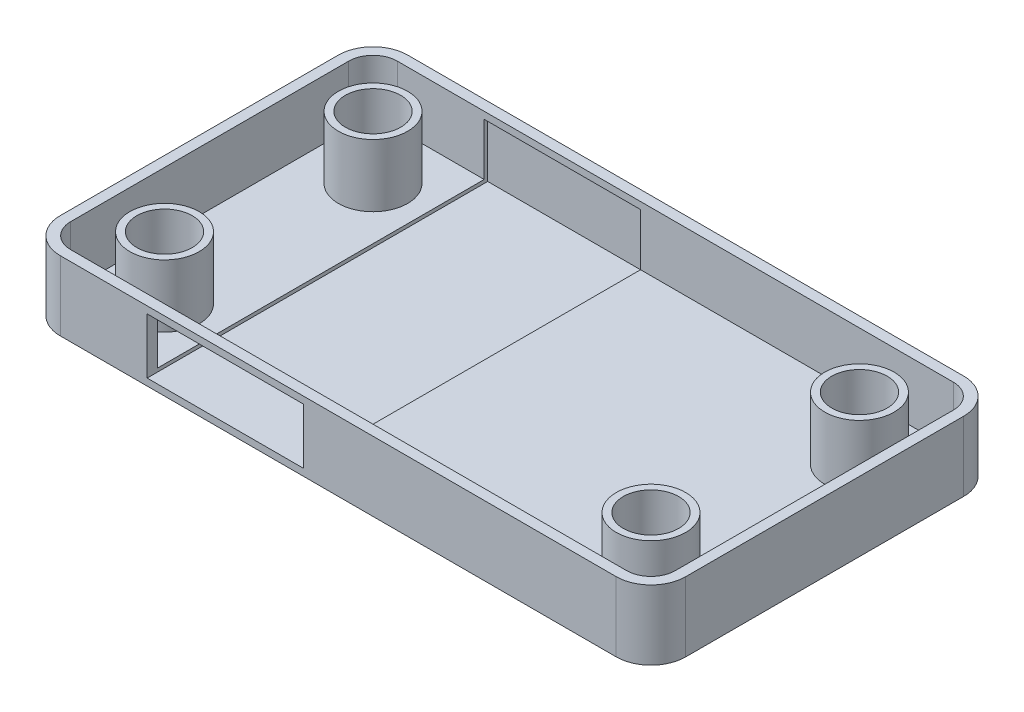
ISO-10303-21;
HEADER;
FILE_DESCRIPTION(('STEP AP214'),'2;1');
FILE_NAME('part.step','',(''),(''),'','','');
FILE_SCHEMA(('AUTOMOTIVE_DESIGN { 1 0 10303 214 1 1 1 1 }'));
ENDSEC;
DATA;
#1=APPLICATION_CONTEXT('core data for automotive mechanical design processes');
#2=APPLICATION_PROTOCOL_DEFINITION('international standard','automotive_design',2000,#1);
#3=PRODUCT_CONTEXT('',#1,'mechanical');
#4=PRODUCT('Part','Part','',(#3));
#5=PRODUCT_RELATED_PRODUCT_CATEGORY('part','',(#4));
#6=PRODUCT_DEFINITION_FORMATION('','',#4);
#7=PRODUCT_DEFINITION_CONTEXT('part definition',#1,'design');
#8=PRODUCT_DEFINITION('design','',#6,#7);
#9=PRODUCT_DEFINITION_SHAPE('','',#8);
#10=(LENGTH_UNIT() NAMED_UNIT(*) SI_UNIT(.MILLI.,.METRE.));
#11=(NAMED_UNIT(*) PLANE_ANGLE_UNIT() SI_UNIT($,.RADIAN.));
#12=(NAMED_UNIT(*) SI_UNIT($,.STERADIAN.) SOLID_ANGLE_UNIT());
#13=UNCERTAINTY_MEASURE_WITH_UNIT(LENGTH_MEASURE(1.E-05),#10,'distance_accuracy_value','');
#14=(GEOMETRIC_REPRESENTATION_CONTEXT(3) GLOBAL_UNCERTAINTY_ASSIGNED_CONTEXT((#13)) GLOBAL_UNIT_ASSIGNED_CONTEXT((#10,
#11,#12)) REPRESENTATION_CONTEXT('',''));
#15=CARTESIAN_POINT('',(0.,0.,0.));
#16=DIRECTION('',(0.,0.,1.));
#17=DIRECTION('',(1.,0.,0.));
#18=AXIS2_PLACEMENT_3D('',#15,#16,#17);
#19=CARTESIAN_POINT('',(-80.,3.,-40.));
#20=DIRECTION('',(0.,-1.,0.));
#21=DIRECTION('',(0.,0.,-1.));
#22=AXIS2_PLACEMENT_3D('',#19,#20,#21);
#23=PLANE('',#22);
#24=CARTESIAN_POINT('',(-70.,3.,30.));
#25=DIRECTION('',(0.,-1.,0.));
#26=DIRECTION('',(0.,0.,-1.));
#27=AXIS2_PLACEMENT_3D('',#24,#25,#26);
#28=CIRCLE('',#27,9.97285125692813);
#29=CARTESIAN_POINT('',(-70.,3.,20.0271487430719));
#30=VERTEX_POINT('',#29);
#31=EDGE_CURVE('E419',#30,#30,#28,.F.);
#32=ORIENTED_EDGE('',*,*,#31,.F.);
#33=EDGE_LOOP('',(#32));
#34=FACE_BOUND('',#33,.T.);
#35=CARTESIAN_POINT('',(-70.,3.,-30.));
#36=DIRECTION('',(0.,-1.,0.));
#37=DIRECTION('',(0.,0.,-1.));
#38=AXIS2_PLACEMENT_3D('',#35,#36,#37);
#39=CIRCLE('',#38,9.97285125692813);
#40=CARTESIAN_POINT('',(-70.,3.,-39.9728512569281));
#41=VERTEX_POINT('',#40);
#42=EDGE_CURVE('E395',#41,#41,#39,.F.);
#43=ORIENTED_EDGE('',*,*,#42,.F.);
#44=EDGE_LOOP('',(#43));
#45=FACE_BOUND('',#44,.T.);
#46=DIRECTION('',(1.,0.,0.));
#47=VECTOR('',#46,1.);
#48=CARTESIAN_POINT('',(-80.,3.,47.));
#49=LINE('',#48,#47);
#50=CARTESIAN_POINT('',(-79.9999999999999,3.,47.));
#51=VERTEX_POINT('',#50);
#52=CARTESIAN_POINT('',(-55.,3.,47.));
#53=VERTEX_POINT('',#52);
#54=EDGE_CURVE('E305',#51,#53,#49,.T.);
#55=ORIENTED_EDGE('',*,*,#54,.T.);
#56=DIRECTION('',(0.,0.,-1.));
#57=VECTOR('',#56,1.);
#58=CARTESIAN_POINT('',(-55.,3.,-40.));
#59=LINE('',#58,#57);
#60=CARTESIAN_POINT('',(-55.,3.,-47.));
#61=VERTEX_POINT('',#60);
#62=EDGE_CURVE('E243',#53,#61,#59,.T.);
#63=ORIENTED_EDGE('',*,*,#62,.T.);
#64=DIRECTION('',(1.,0.,0.));
#65=VECTOR('',#64,1.);
#66=CARTESIAN_POINT('',(-80.,3.,-47.));
#67=LINE('',#66,#65);
#68=CARTESIAN_POINT('',(-80.,3.,-47.));
#69=VERTEX_POINT('',#68);
#70=EDGE_CURVE('E326',#69,#61,#67,.T.);
#71=ORIENTED_EDGE('',*,*,#70,.F.);
#72=CARTESIAN_POINT('',(-80.,3.,-40.));
#73=DIRECTION('',(0.,-1.,0.));
#74=DIRECTION('',(0.,0.,-1.));
#75=AXIS2_PLACEMENT_3D('',#72,#73,#74);
#76=CIRCLE('',#75,7.);
#77=CARTESIAN_POINT('',(-87.,3.,-39.9999999999999));
#78=VERTEX_POINT('',#77);
#79=EDGE_CURVE('E284',#78,#69,#76,.T.);
#80=ORIENTED_EDGE('',*,*,#79,.F.);
#81=DIRECTION('',(0.,0.,-1.));
#82=VECTOR('',#81,1.);
#83=CARTESIAN_POINT('',(-87.,3.,-40.));
#84=LINE('',#83,#82);
#85=CARTESIAN_POINT('',(-87.,3.,40.));
#86=VERTEX_POINT('',#85);
#87=EDGE_CURVE('E296',#86,#78,#84,.T.);
#88=ORIENTED_EDGE('',*,*,#87,.F.);
#89=CARTESIAN_POINT('',(-80.,3.,40.));
#90=DIRECTION('',(0.,-1.,0.));
#91=DIRECTION('',(0.,0.,-1.));
#92=AXIS2_PLACEMENT_3D('',#89,#90,#91);
#93=CIRCLE('',#92,7.);
#94=EDGE_CURVE('E300',#51,#86,#93,.T.);
#95=ORIENTED_EDGE('',*,*,#94,.F.);
#96=EDGE_LOOP('',(#55,#63,#71,#80,#88,#95));
#97=FACE_BOUND('',#96,.T.);
#98=ADVANCED_FACE('F35',(#34,#45,#97),#23,.F.);
#99=CARTESIAN_POINT('',(-10.,3.,-47.));
#100=VERTEX_POINT('',#99);
#101=CARTESIAN_POINT('',(79.9999999999999,3.,-47.));
#102=VERTEX_POINT('',#101);
#103=EDGE_CURVE('E287',#100,#102,#67,.T.);
#104=ORIENTED_EDGE('',*,*,#103,.F.);
#105=DIRECTION('',(0.,0.,1.));
#106=VECTOR('',#105,1.);
#107=CARTESIAN_POINT('',(-10.,3.,-40.));
#108=LINE('',#107,#106);
#109=CARTESIAN_POINT('',(-10.,3.,47.));
#110=VERTEX_POINT('',#109);
#111=EDGE_CURVE('E58',#100,#110,#108,.T.);
#112=ORIENTED_EDGE('',*,*,#111,.T.);
#113=CARTESIAN_POINT('',(80.,3.,47.));
#114=VERTEX_POINT('',#113);
#115=EDGE_CURVE('E310',#110,#114,#49,.T.);
#116=ORIENTED_EDGE('',*,*,#115,.T.);
#117=CARTESIAN_POINT('',(80.,3.,40.));
#118=DIRECTION('',(0.,-1.,0.));
#119=DIRECTION('',(0.,0.,-1.));
#120=AXIS2_PLACEMENT_3D('',#117,#118,#119);
#121=CIRCLE('',#120,7.);
#122=CARTESIAN_POINT('',(87.,3.,39.9999999999999));
#123=VERTEX_POINT('',#122);
#124=EDGE_CURVE('E314',#114,#123,#121,.F.);
#125=ORIENTED_EDGE('',*,*,#124,.T.);
#126=DIRECTION('',(0.,0.,-1.));
#127=VECTOR('',#126,1.);
#128=CARTESIAN_POINT('',(87.,3.,-40.));
#129=LINE('',#128,#127);
#130=CARTESIAN_POINT('',(87.,3.,-40.));
#131=VERTEX_POINT('',#130);
#132=EDGE_CURVE('E316',#123,#131,#129,.T.);
#133=ORIENTED_EDGE('',*,*,#132,.T.);
#134=CARTESIAN_POINT('',(80.,3.,-40.));
#135=DIRECTION('',(0.,-1.,0.));
#136=DIRECTION('',(0.,0.,-1.));
#137=AXIS2_PLACEMENT_3D('',#134,#135,#136);
#138=CIRCLE('',#137,7.);
#139=EDGE_CURVE('E322',#102,#131,#138,.T.);
#140=ORIENTED_EDGE('',*,*,#139,.F.);
#141=EDGE_LOOP('',(#104,#112,#116,#125,#133,#140));
#142=FACE_BOUND('',#141,.T.);
#143=CARTESIAN_POINT('',(70.,3.,-30.));
#144=DIRECTION('',(0.,-1.,0.));
#145=DIRECTION('',(0.,0.,-1.));
#146=AXIS2_PLACEMENT_3D('',#143,#144,#145);
#147=CIRCLE('',#146,9.97285125692813);
#148=CARTESIAN_POINT('',(70.,3.,-39.9728512569282));
#149=VERTEX_POINT('',#148);
#150=EDGE_CURVE('E413',#149,#149,#147,.F.);
#151=ORIENTED_EDGE('',*,*,#150,.F.);
#152=EDGE_LOOP('',(#151));
#153=FACE_BOUND('',#152,.T.);
#154=CARTESIAN_POINT('',(69.9999999999999,3.,30.));
#155=DIRECTION('',(0.,-1.,0.));
#156=DIRECTION('',(0.,0.,-1.));
#157=AXIS2_PLACEMENT_3D('',#154,#155,#156);
#158=CIRCLE('',#157,9.97285125692813);
#159=CARTESIAN_POINT('',(69.9999999999999,3.,20.0271487430719));
#160=VERTEX_POINT('',#159);
#161=EDGE_CURVE('E416',#160,#160,#158,.F.);
#162=ORIENTED_EDGE('',*,*,#161,.F.);
#163=EDGE_LOOP('',(#162));
#164=FACE_BOUND('',#163,.T.);
#165=ADVANCED_FACE('F466',(#142,#153,#164),#23,.F.);
#166=CARTESIAN_POINT('',(-80.,20.,-40.));
#167=DIRECTION('',(0.,-1.,0.));
#168=DIRECTION('',(0.,0.,-1.));
#169=AXIS2_PLACEMENT_3D('',#166,#167,#168);
#170=CYLINDRICAL_SURFACE('',#169,10.);
#171=CARTESIAN_POINT('',(-80.,0.,-40.));
#172=DIRECTION('',(0.,-1.,0.));
#173=DIRECTION('',(0.,0.,-1.));
#174=AXIS2_PLACEMENT_3D('',#171,#172,#173);
#175=CIRCLE('',#174,10.);
#176=CARTESIAN_POINT('',(-90.,0.,-39.9999999999999));
#177=VERTEX_POINT('',#176);
#178=CARTESIAN_POINT('',(-79.9999999999999,0.,-50.));
#179=VERTEX_POINT('',#178);
#180=EDGE_CURVE('E290',#177,#179,#175,.T.);
#181=ORIENTED_EDGE('',*,*,#180,.F.);
#182=DIRECTION('',(0.,-1.,0.));
#183=VECTOR('',#182,1.);
#184=CARTESIAN_POINT('',(-90.,20.,-39.9999999999999));
#185=LINE('',#184,#183);
#186=CARTESIAN_POINT('',(-90.,20.,-39.9999999999999));
#187=VERTEX_POINT('',#186);
#188=EDGE_CURVE('E393',#187,#177,#185,.T.);
#189=ORIENTED_EDGE('',*,*,#188,.F.);
#190=CARTESIAN_POINT('',(-80.,20.,-40.));
#191=DIRECTION('',(0.,-1.,0.));
#192=DIRECTION('',(0.,0.,-1.));
#193=AXIS2_PLACEMENT_3D('',#190,#191,#192);
#194=CIRCLE('',#193,10.);
#195=CARTESIAN_POINT('',(-79.9999999999999,20.,-50.));
#196=VERTEX_POINT('',#195);
#197=EDGE_CURVE('E350',#187,#196,#194,.T.);
#198=ORIENTED_EDGE('',*,*,#197,.T.);
#199=DIRECTION('',(0.,-1.,0.));
#200=VECTOR('',#199,1.);
#201=CARTESIAN_POINT('',(-79.9999999999999,20.,-50.));
#202=LINE('',#201,#200);
#203=EDGE_CURVE('E372',#196,#179,#202,.T.);
#204=ORIENTED_EDGE('',*,*,#203,.T.);
#205=EDGE_LOOP('',(#181,#189,#198,#204));
#206=FACE_BOUND('',#205,.T.);
#207=ADVANCED_FACE('F37',(#206),#170,.T.);
#208=CARTESIAN_POINT('',(-90.,20.,39.9999999999999));
#209=DIRECTION('',(-1.,0.,0.));
#210=DIRECTION('',(0.,0.,1.));
#211=AXIS2_PLACEMENT_3D('',#208,#209,#210);
#212=PLANE('',#211);
#213=DIRECTION('',(0.,0.,-1.));
#214=VECTOR('',#213,1.);
#215=CARTESIAN_POINT('',(-90.,0.,39.9999999999999));
#216=LINE('',#215,#214);
#217=CARTESIAN_POINT('',(-90.,0.,39.9999999999999));
#218=VERTEX_POINT('',#217);
#219=EDGE_CURVE('E354',#218,#177,#216,.T.);
#220=ORIENTED_EDGE('',*,*,#219,.F.);
#221=DIRECTION('',(0.,-1.,0.));
#222=VECTOR('',#221,1.);
#223=CARTESIAN_POINT('',(-90.,20.,39.9999999999999));
#224=LINE('',#223,#222);
#225=CARTESIAN_POINT('',(-90.,20.,39.9999999999999));
#226=VERTEX_POINT('',#225);
#227=EDGE_CURVE('E396',#226,#218,#224,.T.);
#228=ORIENTED_EDGE('',*,*,#227,.F.);
#229=DIRECTION('',(0.,0.,-1.));
#230=VECTOR('',#229,1.);
#231=CARTESIAN_POINT('',(-90.,20.,39.9999999999999));
#232=LINE('',#231,#230);
#233=EDGE_CURVE('E369',#226,#187,#232,.T.);
#234=ORIENTED_EDGE('',*,*,#233,.T.);
#235=ORIENTED_EDGE('',*,*,#188,.T.);
#236=EDGE_LOOP('',(#220,#228,#234,#235));
#237=FACE_BOUND('',#236,.T.);
#238=ADVANCED_FACE('F797',(#237),#212,.T.);
#239=CARTESIAN_POINT('',(-80.,20.,40.));
#240=DIRECTION('',(0.,-1.,0.));
#241=DIRECTION('',(0.,0.,-1.));
#242=AXIS2_PLACEMENT_3D('',#239,#240,#241);
#243=CYLINDRICAL_SURFACE('',#242,10.);
#244=CARTESIAN_POINT('',(-80.,0.,40.));
#245=DIRECTION('',(0.,-1.,0.));
#246=DIRECTION('',(0.,0.,-1.));
#247=AXIS2_PLACEMENT_3D('',#244,#245,#246);
#248=CIRCLE('',#247,10.);
#249=CARTESIAN_POINT('',(-79.9999999999999,0.,50.));
#250=VERTEX_POINT('',#249);
#251=EDGE_CURVE('E388',#250,#218,#248,.T.);
#252=ORIENTED_EDGE('',*,*,#251,.F.);
#253=DIRECTION('',(0.,-1.,0.));
#254=VECTOR('',#253,1.);
#255=CARTESIAN_POINT('',(-79.9999999999999,20.,50.));
#256=LINE('',#255,#254);
#257=CARTESIAN_POINT('',(-79.9999999999999,20.,50.));
#258=VERTEX_POINT('',#257);
#259=EDGE_CURVE('E398',#258,#250,#256,.T.);
#260=ORIENTED_EDGE('',*,*,#259,.F.);
#261=CARTESIAN_POINT('',(-80.,20.,40.));
#262=DIRECTION('',(0.,-1.,0.));
#263=DIRECTION('',(0.,0.,-1.));
#264=AXIS2_PLACEMENT_3D('',#261,#262,#263);
#265=CIRCLE('',#264,10.);
#266=EDGE_CURVE('E366',#258,#226,#265,.T.);
#267=ORIENTED_EDGE('',*,*,#266,.T.);
#268=ORIENTED_EDGE('',*,*,#227,.T.);
#269=EDGE_LOOP('',(#252,#260,#267,#268));
#270=FACE_BOUND('',#269,.T.);
#271=ADVANCED_FACE('F717',(#270),#243,.T.);
#272=CARTESIAN_POINT('',(-79.9999999999999,20.,50.));
#273=DIRECTION('',(0.,0.,-1.));
#274=DIRECTION('',(-1.,0.,0.));
#275=AXIS2_PLACEMENT_3D('',#272,#273,#274);
#276=PLANE('',#275);
#277=DIRECTION('',(1.,0.,0.));
#278=VECTOR('',#277,1.);
#279=CARTESIAN_POINT('',(-55.,2.,50.));
#280=LINE('',#279,#278);
#281=CARTESIAN_POINT('',(-55.,2.,50.));
#282=VERTEX_POINT('',#281);
#283=CARTESIAN_POINT('',(-10.,2.,50.));
#284=VERTEX_POINT('',#283);
#285=EDGE_CURVE('E226',#282,#284,#280,.T.);
#286=ORIENTED_EDGE('',*,*,#285,.F.);
#287=DIRECTION('',(0.,-1.,0.));
#288=VECTOR('',#287,1.);
#289=CARTESIAN_POINT('',(-55.,18.,50.));
#290=LINE('',#289,#288);
#291=CARTESIAN_POINT('',(-55.,18.,50.));
#292=VERTEX_POINT('',#291);
#293=EDGE_CURVE('E50',#292,#282,#290,.T.);
#294=ORIENTED_EDGE('',*,*,#293,.F.);
#295=DIRECTION('',(-1.,0.,0.));
#296=VECTOR('',#295,1.);
#297=CARTESIAN_POINT('',(-55.,18.,50.));
#298=LINE('',#297,#296);
#299=CARTESIAN_POINT('',(-10.,18.,50.));
#300=VERTEX_POINT('',#299);
#301=EDGE_CURVE('E217',#300,#292,#298,.T.);
#302=ORIENTED_EDGE('',*,*,#301,.F.);
#303=DIRECTION('',(0.,1.,0.));
#304=VECTOR('',#303,1.);
#305=CARTESIAN_POINT('',(-10.,18.,50.));
#306=LINE('',#305,#304);
#307=EDGE_CURVE('E220',#284,#300,#306,.T.);
#308=ORIENTED_EDGE('',*,*,#307,.F.);
#309=EDGE_LOOP('',(#286,#294,#302,#308));
#310=FACE_BOUND('',#309,.T.);
#311=DIRECTION('',(1.,0.,0.));
#312=VECTOR('',#311,1.);
#313=CARTESIAN_POINT('',(-79.9999999999999,0.,50.));
#314=LINE('',#313,#312);
#315=CARTESIAN_POINT('',(79.9999999999999,0.,50.));
#316=VERTEX_POINT('',#315);
#317=EDGE_CURVE('E386',#250,#316,#314,.T.);
#318=ORIENTED_EDGE('',*,*,#317,.T.);
#319=DIRECTION('',(0.,-1.,0.));
#320=VECTOR('',#319,1.);
#321=CARTESIAN_POINT('',(79.9999999999999,20.,50.));
#322=LINE('',#321,#320);
#323=CARTESIAN_POINT('',(79.9999999999999,20.,50.));
#324=VERTEX_POINT('',#323);
#325=EDGE_CURVE('E400',#324,#316,#322,.T.);
#326=ORIENTED_EDGE('',*,*,#325,.F.);
#327=DIRECTION('',(1.,0.,0.));
#328=VECTOR('',#327,1.);
#329=CARTESIAN_POINT('',(-79.9999999999999,20.,50.));
#330=LINE('',#329,#328);
#331=EDGE_CURVE('E364',#258,#324,#330,.T.);
#332=ORIENTED_EDGE('',*,*,#331,.F.);
#333=ORIENTED_EDGE('',*,*,#259,.T.);
#334=EDGE_LOOP('',(#318,#326,#332,#333));
#335=FACE_BOUND('',#334,.T.);
#336=ADVANCED_FACE('F459',(#310,#335),#276,.F.);
#337=CARTESIAN_POINT('',(80.,20.,40.));
#338=DIRECTION('',(0.,-1.,0.));
#339=DIRECTION('',(0.,0.,-1.));
#340=AXIS2_PLACEMENT_3D('',#337,#338,#339);
#341=CYLINDRICAL_SURFACE('',#340,10.);
#342=CARTESIAN_POINT('',(80.,0.,40.));
#343=DIRECTION('',(0.,1.,0.));
#344=DIRECTION('',(0.,0.,1.));
#345=AXIS2_PLACEMENT_3D('',#342,#343,#344);
#346=CIRCLE('',#345,10.);
#347=CARTESIAN_POINT('',(90.,0.,39.9999999999999));
#348=VERTEX_POINT('',#347);
#349=EDGE_CURVE('E384',#316,#348,#346,.T.);
#350=ORIENTED_EDGE('',*,*,#349,.T.);
#351=DIRECTION('',(0.,-1.,0.));
#352=VECTOR('',#351,1.);
#353=CARTESIAN_POINT('',(90.,20.,39.9999999999999));
#354=LINE('',#353,#352);
#355=CARTESIAN_POINT('',(90.,20.,39.9999999999999));
#356=VERTEX_POINT('',#355);
#357=EDGE_CURVE('E403',#356,#348,#354,.T.);
#358=ORIENTED_EDGE('',*,*,#357,.F.);
#359=CARTESIAN_POINT('',(80.,20.,40.));
#360=DIRECTION('',(0.,1.,0.));
#361=DIRECTION('',(0.,0.,1.));
#362=AXIS2_PLACEMENT_3D('',#359,#360,#361);
#363=CIRCLE('',#362,10.);
#364=EDGE_CURVE('E362',#324,#356,#363,.T.);
#365=ORIENTED_EDGE('',*,*,#364,.F.);
#366=ORIENTED_EDGE('',*,*,#325,.T.);
#367=EDGE_LOOP('',(#350,#358,#365,#366));
#368=FACE_BOUND('',#367,.T.);
#369=ADVANCED_FACE('F716',(#368),#341,.T.);
#370=CARTESIAN_POINT('',(90.,20.,39.9999999999999));
#371=DIRECTION('',(-1.,0.,0.));
#372=DIRECTION('',(0.,0.,1.));
#373=AXIS2_PLACEMENT_3D('',#370,#371,#372);
#374=PLANE('',#373);
#375=DIRECTION('',(0.,0.,-1.));
#376=VECTOR('',#375,1.);
#377=CARTESIAN_POINT('',(90.,0.,39.9999999999999));
#378=LINE('',#377,#376);
#379=CARTESIAN_POINT('',(90.,0.,-39.9999999999999));
#380=VERTEX_POINT('',#379);
#381=EDGE_CURVE('E381',#348,#380,#378,.T.);
#382=ORIENTED_EDGE('',*,*,#381,.T.);
#383=DIRECTION('',(0.,-1.,0.));
#384=VECTOR('',#383,1.);
#385=CARTESIAN_POINT('',(90.,20.,-39.9999999999999));
#386=LINE('',#385,#384);
#387=CARTESIAN_POINT('',(90.,20.,-39.9999999999999));
#388=VERTEX_POINT('',#387);
#389=EDGE_CURVE('E406',#388,#380,#386,.T.);
#390=ORIENTED_EDGE('',*,*,#389,.F.);
#391=DIRECTION('',(0.,0.,-1.));
#392=VECTOR('',#391,1.);
#393=CARTESIAN_POINT('',(90.,20.,39.9999999999999));
#394=LINE('',#393,#392);
#395=EDGE_CURVE('E360',#356,#388,#394,.T.);
#396=ORIENTED_EDGE('',*,*,#395,.F.);
#397=ORIENTED_EDGE('',*,*,#357,.T.);
#398=EDGE_LOOP('',(#382,#390,#396,#397));
#399=FACE_BOUND('',#398,.T.);
#400=ADVANCED_FACE('F732',(#399),#374,.F.);
#401=CARTESIAN_POINT('',(80.,20.,-40.));
#402=DIRECTION('',(0.,-1.,0.));
#403=DIRECTION('',(0.,0.,-1.));
#404=AXIS2_PLACEMENT_3D('',#401,#402,#403);
#405=CYLINDRICAL_SURFACE('',#404,10.);
#406=CARTESIAN_POINT('',(80.,0.,-40.));
#407=DIRECTION('',(0.,-1.,0.));
#408=DIRECTION('',(0.,0.,-1.));
#409=AXIS2_PLACEMENT_3D('',#406,#407,#408);
#410=CIRCLE('',#409,10.);
#411=CARTESIAN_POINT('',(79.9999999999999,0.,-50.));
#412=VERTEX_POINT('',#411);
#413=EDGE_CURVE('E378',#412,#380,#410,.T.);
#414=ORIENTED_EDGE('',*,*,#413,.F.);
#415=DIRECTION('',(0.,-1.,0.));
#416=VECTOR('',#415,1.);
#417=CARTESIAN_POINT('',(79.9999999999999,20.,-50.));
#418=LINE('',#417,#416);
#419=CARTESIAN_POINT('',(79.9999999999999,20.,-50.));
#420=VERTEX_POINT('',#419);
#421=EDGE_CURVE('E408',#420,#412,#418,.T.);
#422=ORIENTED_EDGE('',*,*,#421,.F.);
#423=CARTESIAN_POINT('',(80.,20.,-40.));
#424=DIRECTION('',(0.,-1.,0.));
#425=DIRECTION('',(0.,0.,-1.));
#426=AXIS2_PLACEMENT_3D('',#423,#424,#425);
#427=CIRCLE('',#426,10.);
#428=EDGE_CURVE('E357',#420,#388,#427,.T.);
#429=ORIENTED_EDGE('',*,*,#428,.T.);
#430=ORIENTED_EDGE('',*,*,#389,.T.);
#431=EDGE_LOOP('',(#414,#422,#429,#430));
#432=FACE_BOUND('',#431,.T.);
#433=ADVANCED_FACE('F739',(#432),#405,.T.);
#434=CARTESIAN_POINT('',(-79.9999999999999,20.,-50.));
#435=DIRECTION('',(0.,0.,-1.));
#436=DIRECTION('',(-1.,0.,0.));
#437=AXIS2_PLACEMENT_3D('',#434,#435,#436);
#438=PLANE('',#437);
#439=DIRECTION('',(1.,0.,0.));
#440=VECTOR('',#439,1.);
#441=CARTESIAN_POINT('',(-79.9999999999999,0.,-50.));
#442=LINE('',#441,#440);
#443=EDGE_CURVE('E375',#179,#412,#442,.T.);
#444=ORIENTED_EDGE('',*,*,#443,.F.);
#445=ORIENTED_EDGE('',*,*,#203,.F.);
#446=DIRECTION('',(1.,0.,0.));
#447=VECTOR('',#446,1.);
#448=CARTESIAN_POINT('',(-79.9999999999999,20.,-50.));
#449=LINE('',#448,#447);
#450=EDGE_CURVE('E353',#196,#420,#449,.T.);
#451=ORIENTED_EDGE('',*,*,#450,.T.);
#452=ORIENTED_EDGE('',*,*,#421,.T.);
#453=EDGE_LOOP('',(#444,#445,#451,#452));
#454=FACE_BOUND('',#453,.T.);
#455=ADVANCED_FACE('F747',(#454),#438,.T.);
#456=CARTESIAN_POINT('',(-80.,20.,-40.));
#457=DIRECTION('',(0.,-1.,0.));
#458=DIRECTION('',(0.,0.,-1.));
#459=AXIS2_PLACEMENT_3D('',#456,#457,#458);
#460=PLANE('',#459);
#461=DIRECTION('',(0.,0.,-1.));
#462=VECTOR('',#461,1.);
#463=CARTESIAN_POINT('',(-87.,20.,-40.));
#464=LINE('',#463,#462);
#465=CARTESIAN_POINT('',(-87.,20.,39.9999999999999));
#466=VERTEX_POINT('',#465);
#467=CARTESIAN_POINT('',(-87.,20.,-40.));
#468=VERTEX_POINT('',#467);
#469=EDGE_CURVE('E295',#466,#468,#464,.T.);
#470=ORIENTED_EDGE('',*,*,#469,.T.);
#471=CARTESIAN_POINT('',(-80.,20.,-40.));
#472=DIRECTION('',(0.,-1.,0.));
#473=DIRECTION('',(0.,0.,-1.));
#474=AXIS2_PLACEMENT_3D('',#471,#472,#473);
#475=CIRCLE('',#474,7.);
#476=CARTESIAN_POINT('',(-79.9999999999999,20.,-47.));
#477=VERTEX_POINT('',#476);
#478=EDGE_CURVE('E299',#468,#477,#475,.T.);
#479=ORIENTED_EDGE('',*,*,#478,.T.);
#480=DIRECTION('',(1.,0.,0.));
#481=VECTOR('',#480,1.);
#482=CARTESIAN_POINT('',(-80.,20.,-47.));
#483=LINE('',#482,#481);
#484=CARTESIAN_POINT('',(79.9999999999999,20.,-47.));
#485=VERTEX_POINT('',#484);
#486=EDGE_CURVE('E333',#477,#485,#483,.T.);
#487=ORIENTED_EDGE('',*,*,#486,.T.);
#488=CARTESIAN_POINT('',(80.,20.,-40.));
#489=DIRECTION('',(0.,-1.,0.));
#490=DIRECTION('',(0.,0.,-1.));
#491=AXIS2_PLACEMENT_3D('',#488,#489,#490);
#492=CIRCLE('',#491,7.);
#493=CARTESIAN_POINT('',(87.,20.,-39.9999999999999));
#494=VERTEX_POINT('',#493);
#495=EDGE_CURVE('E345',#485,#494,#492,.T.);
#496=ORIENTED_EDGE('',*,*,#495,.T.);
#497=DIRECTION('',(0.,0.,-1.));
#498=VECTOR('',#497,1.);
#499=CARTESIAN_POINT('',(87.,20.,-40.));
#500=LINE('',#499,#498);
#501=CARTESIAN_POINT('',(87.,20.,40.));
#502=VERTEX_POINT('',#501);
#503=EDGE_CURVE('E343',#502,#494,#500,.T.);
#504=ORIENTED_EDGE('',*,*,#503,.F.);
#505=CARTESIAN_POINT('',(80.,20.,40.));
#506=DIRECTION('',(0.,-1.,0.));
#507=DIRECTION('',(0.,0.,-1.));
#508=AXIS2_PLACEMENT_3D('',#505,#506,#507);
#509=CIRCLE('',#508,7.);
#510=CARTESIAN_POINT('',(79.9999999999999,20.,47.));
#511=VERTEX_POINT('',#510);
#512=EDGE_CURVE('E341',#511,#502,#509,.F.);
#513=ORIENTED_EDGE('',*,*,#512,.F.);
#514=DIRECTION('',(1.,0.,0.));
#515=VECTOR('',#514,1.);
#516=CARTESIAN_POINT('',(-80.,20.,47.));
#517=LINE('',#516,#515);
#518=CARTESIAN_POINT('',(-80.,20.,47.));
#519=VERTEX_POINT('',#518);
#520=EDGE_CURVE('E339',#519,#511,#517,.T.);
#521=ORIENTED_EDGE('',*,*,#520,.F.);
#522=CARTESIAN_POINT('',(-80.,20.,40.));
#523=DIRECTION('',(0.,-1.,0.));
#524=DIRECTION('',(0.,0.,-1.));
#525=AXIS2_PLACEMENT_3D('',#522,#523,#524);
#526=CIRCLE('',#525,7.);
#527=EDGE_CURVE('E336',#519,#466,#526,.T.);
#528=ORIENTED_EDGE('',*,*,#527,.T.);
#529=EDGE_LOOP('',(#470,#479,#487,#496,#504,#513,#521,#528));
#530=FACE_BOUND('',#529,.T.);
#531=ORIENTED_EDGE('',*,*,#197,.F.);
#532=ORIENTED_EDGE('',*,*,#233,.F.);
#533=ORIENTED_EDGE('',*,*,#266,.F.);
#534=ORIENTED_EDGE('',*,*,#331,.T.);
#535=ORIENTED_EDGE('',*,*,#364,.T.);
#536=ORIENTED_EDGE('',*,*,#395,.T.);
#537=ORIENTED_EDGE('',*,*,#428,.F.);
#538=ORIENTED_EDGE('',*,*,#450,.F.);
#539=EDGE_LOOP('',(#531,#532,#533,#534,#535,#536,#537,#538));
#540=FACE_BOUND('',#539,.T.);
#541=ADVANCED_FACE('F474',(#530,#540),#460,.F.);
#542=CARTESIAN_POINT('',(-80.,0.,-40.));
#543=DIRECTION('',(0.,-1.,0.));
#544=DIRECTION('',(0.,0.,-1.));
#545=AXIS2_PLACEMENT_3D('',#542,#543,#544);
#546=PLANE('',#545);
#547=ORIENTED_EDGE('',*,*,#180,.T.);
#548=ORIENTED_EDGE('',*,*,#443,.T.);
#549=ORIENTED_EDGE('',*,*,#413,.T.);
#550=ORIENTED_EDGE('',*,*,#381,.F.);
#551=ORIENTED_EDGE('',*,*,#349,.F.);
#552=ORIENTED_EDGE('',*,*,#317,.F.);
#553=ORIENTED_EDGE('',*,*,#251,.T.);
#554=ORIENTED_EDGE('',*,*,#219,.T.);
#555=EDGE_LOOP('',(#547,#548,#549,#550,#551,#552,#553,#554));
#556=FACE_BOUND('',#555,.T.);
#557=ADVANCED_FACE('F580',(#556),#546,.T.);
#558=CARTESIAN_POINT('',(-80.,20.,-40.));
#559=DIRECTION('',(0.,-1.,0.));
#560=DIRECTION('',(0.,0.,-1.));
#561=AXIS2_PLACEMENT_3D('',#558,#559,#560);
#562=CYLINDRICAL_SURFACE('',#561,7.);
#563=ORIENTED_EDGE('',*,*,#79,.T.);
#564=DIRECTION('',(0.,-1.,0.));
#565=VECTOR('',#564,1.);
#566=CARTESIAN_POINT('',(-80.,20.,-47.));
#567=LINE('',#566,#565);
#568=EDGE_CURVE('E292',#477,#69,#567,.T.);
#569=ORIENTED_EDGE('',*,*,#568,.F.);
#570=ORIENTED_EDGE('',*,*,#478,.F.);
#571=DIRECTION('',(0.,1.,0.));
#572=VECTOR('',#571,1.);
#573=CARTESIAN_POINT('',(-87.,20.,-39.9999999999999));
#574=LINE('',#573,#572);
#575=EDGE_CURVE('E288',#468,#78,#574,.F.);
#576=ORIENTED_EDGE('',*,*,#575,.T.);
#577=EDGE_LOOP('',(#563,#569,#570,#576));
#578=FACE_BOUND('',#577,.T.);
#579=ADVANCED_FACE('F439',(#578),#562,.F.);
#580=CARTESIAN_POINT('',(-87.,20.,39.9999999999999));
#581=DIRECTION('',(-1.,0.,0.));
#582=DIRECTION('',(0.,0.,1.));
#583=AXIS2_PLACEMENT_3D('',#580,#581,#582);
#584=PLANE('',#583);
#585=ORIENTED_EDGE('',*,*,#87,.T.);
#586=ORIENTED_EDGE('',*,*,#575,.F.);
#587=ORIENTED_EDGE('',*,*,#469,.F.);
#588=DIRECTION('',(0.,-1.,0.));
#589=VECTOR('',#588,1.);
#590=CARTESIAN_POINT('',(-87.,20.,40.));
#591=LINE('',#590,#589);
#592=EDGE_CURVE('E291',#466,#86,#591,.T.);
#593=ORIENTED_EDGE('',*,*,#592,.T.);
#594=EDGE_LOOP('',(#585,#586,#587,#593));
#595=FACE_BOUND('',#594,.T.);
#596=ADVANCED_FACE('F442',(#595),#584,.F.);
#597=CARTESIAN_POINT('',(-80.,20.,40.));
#598=DIRECTION('',(0.,-1.,0.));
#599=DIRECTION('',(0.,0.,-1.));
#600=AXIS2_PLACEMENT_3D('',#597,#598,#599);
#601=CYLINDRICAL_SURFACE('',#600,7.);
#602=ORIENTED_EDGE('',*,*,#94,.T.);
#603=ORIENTED_EDGE('',*,*,#592,.F.);
#604=ORIENTED_EDGE('',*,*,#527,.F.);
#605=DIRECTION('',(0.,1.,0.));
#606=VECTOR('',#605,1.);
#607=CARTESIAN_POINT('',(-79.9999999999999,20.,47.));
#608=LINE('',#607,#606);
#609=EDGE_CURVE('E302',#519,#51,#608,.F.);
#610=ORIENTED_EDGE('',*,*,#609,.T.);
#611=EDGE_LOOP('',(#602,#603,#604,#610));
#612=FACE_BOUND('',#611,.T.);
#613=ADVANCED_FACE('F446',(#612),#601,.F.);
#614=CARTESIAN_POINT('',(-79.9999999999999,20.,47.));
#615=DIRECTION('',(0.,0.,-1.));
#616=DIRECTION('',(-1.,0.,0.));
#617=AXIS2_PLACEMENT_3D('',#614,#615,#616);
#618=PLANE('',#617);
#619=DIRECTION('',(0.,1.,0.));
#620=VECTOR('',#619,1.);
#621=CARTESIAN_POINT('',(-55.,20.,47.));
#622=LINE('',#621,#620);
#623=CARTESIAN_POINT('',(-55.,18.,47.));
#624=VERTEX_POINT('',#623);
#625=EDGE_CURVE('E246',#53,#624,#622,.T.);
#626=ORIENTED_EDGE('',*,*,#625,.F.);
#627=ORIENTED_EDGE('',*,*,#54,.F.);
#628=ORIENTED_EDGE('',*,*,#609,.F.);
#629=ORIENTED_EDGE('',*,*,#520,.T.);
#630=DIRECTION('',(0.,-1.,0.));
#631=VECTOR('',#630,1.);
#632=CARTESIAN_POINT('',(80.,20.,47.));
#633=LINE('',#632,#631);
#634=EDGE_CURVE('E307',#511,#114,#633,.T.);
#635=ORIENTED_EDGE('',*,*,#634,.T.);
#636=ORIENTED_EDGE('',*,*,#115,.F.);
#637=DIRECTION('',(0.,-1.,0.));
#638=VECTOR('',#637,1.);
#639=CARTESIAN_POINT('',(-10.,20.,47.));
#640=LINE('',#639,#638);
#641=CARTESIAN_POINT('',(-10.,18.,47.));
#642=VERTEX_POINT('',#641);
#643=EDGE_CURVE('E239',#642,#110,#640,.T.);
#644=ORIENTED_EDGE('',*,*,#643,.F.);
#645=DIRECTION('',(1.,0.,0.));
#646=VECTOR('',#645,1.);
#647=CARTESIAN_POINT('',(-79.9999999999999,18.,47.));
#648=LINE('',#647,#646);
#649=EDGE_CURVE('E241',#624,#642,#648,.T.);
#650=ORIENTED_EDGE('',*,*,#649,.F.);
#651=EDGE_LOOP('',(#626,#627,#628,#629,#635,#636,#644,#650));
#652=FACE_BOUND('',#651,.T.);
#653=ADVANCED_FACE('F449',(#652),#618,.T.);
#654=CARTESIAN_POINT('',(80.,20.,40.));
#655=DIRECTION('',(0.,-1.,0.));
#656=DIRECTION('',(0.,0.,-1.));
#657=AXIS2_PLACEMENT_3D('',#654,#655,#656);
#658=CYLINDRICAL_SURFACE('',#657,7.);
#659=ORIENTED_EDGE('',*,*,#124,.F.);
#660=ORIENTED_EDGE('',*,*,#634,.F.);
#661=ORIENTED_EDGE('',*,*,#512,.T.);
#662=DIRECTION('',(0.,1.,0.));
#663=VECTOR('',#662,1.);
#664=CARTESIAN_POINT('',(87.,20.,39.9999999999999));
#665=LINE('',#664,#663);
#666=EDGE_CURVE('E313',#502,#123,#665,.F.);
#667=ORIENTED_EDGE('',*,*,#666,.T.);
#668=EDGE_LOOP('',(#659,#660,#661,#667));
#669=FACE_BOUND('',#668,.T.);
#670=ADVANCED_FACE('F478',(#669),#658,.F.);
#671=CARTESIAN_POINT('',(87.,20.,39.9999999999999));
#672=DIRECTION('',(-1.,0.,0.));
#673=DIRECTION('',(0.,0.,1.));
#674=AXIS2_PLACEMENT_3D('',#671,#672,#673);
#675=PLANE('',#674);
#676=ORIENTED_EDGE('',*,*,#132,.F.);
#677=ORIENTED_EDGE('',*,*,#666,.F.);
#678=ORIENTED_EDGE('',*,*,#503,.T.);
#679=DIRECTION('',(0.,-1.,0.));
#680=VECTOR('',#679,1.);
#681=CARTESIAN_POINT('',(87.,20.,-40.));
#682=LINE('',#681,#680);
#683=EDGE_CURVE('E319',#494,#131,#682,.T.);
#684=ORIENTED_EDGE('',*,*,#683,.T.);
#685=EDGE_LOOP('',(#676,#677,#678,#684));
#686=FACE_BOUND('',#685,.T.);
#687=ADVANCED_FACE('F482',(#686),#675,.T.);
#688=CARTESIAN_POINT('',(80.,20.,-40.));
#689=DIRECTION('',(0.,-1.,0.));
#690=DIRECTION('',(0.,0.,-1.));
#691=AXIS2_PLACEMENT_3D('',#688,#689,#690);
#692=CYLINDRICAL_SURFACE('',#691,7.);
#693=ORIENTED_EDGE('',*,*,#139,.T.);
#694=ORIENTED_EDGE('',*,*,#683,.F.);
#695=ORIENTED_EDGE('',*,*,#495,.F.);
#696=DIRECTION('',(0.,1.,0.));
#697=VECTOR('',#696,1.);
#698=CARTESIAN_POINT('',(79.9999999999999,20.,-47.));
#699=LINE('',#698,#697);
#700=EDGE_CURVE('E294',#485,#102,#699,.F.);
#701=ORIENTED_EDGE('',*,*,#700,.T.);
#702=EDGE_LOOP('',(#693,#694,#695,#701));
#703=FACE_BOUND('',#702,.T.);
#704=ADVANCED_FACE('F470',(#703),#692,.F.);
#705=CARTESIAN_POINT('',(-79.9999999999999,20.,-47.));
#706=DIRECTION('',(0.,0.,-1.));
#707=DIRECTION('',(-1.,0.,0.));
#708=AXIS2_PLACEMENT_3D('',#705,#706,#707);
#709=PLANE('',#708);
#710=ORIENTED_EDGE('',*,*,#70,.T.);
#711=DIRECTION('',(0.,1.,0.));
#712=VECTOR('',#711,1.);
#713=CARTESIAN_POINT('',(-55.,20.,-47.));
#714=LINE('',#713,#712);
#715=CARTESIAN_POINT('',(-55.,18.,-47.));
#716=VERTEX_POINT('',#715);
#717=EDGE_CURVE('E11',#61,#716,#714,.T.);
#718=ORIENTED_EDGE('',*,*,#717,.T.);
#719=DIRECTION('',(1.,0.,0.));
#720=VECTOR('',#719,1.);
#721=CARTESIAN_POINT('',(-79.9999999999999,18.,-47.));
#722=LINE('',#721,#720);
#723=CARTESIAN_POINT('',(-10.,18.,-47.));
#724=VERTEX_POINT('',#723);
#725=EDGE_CURVE('E43',#716,#724,#722,.T.);
#726=ORIENTED_EDGE('',*,*,#725,.T.);
#727=DIRECTION('',(0.,-1.,0.));
#728=VECTOR('',#727,1.);
#729=CARTESIAN_POINT('',(-10.,20.,-47.));
#730=LINE('',#729,#728);
#731=EDGE_CURVE('E422',#724,#100,#730,.T.);
#732=ORIENTED_EDGE('',*,*,#731,.T.);
#733=ORIENTED_EDGE('',*,*,#103,.T.);
#734=ORIENTED_EDGE('',*,*,#700,.F.);
#735=ORIENTED_EDGE('',*,*,#486,.F.);
#736=ORIENTED_EDGE('',*,*,#568,.T.);
#737=EDGE_LOOP('',(#710,#718,#726,#732,#733,#734,#735,#736));
#738=FACE_BOUND('',#737,.T.);
#739=ADVANCED_FACE('F425',(#738),#709,.F.);
#740=CARTESIAN_POINT('',(-70.,21.,-30.));
#741=DIRECTION('',(0.,1.,0.));
#742=DIRECTION('',(0.,0.,1.));
#743=AXIS2_PLACEMENT_3D('',#740,#741,#742);
#744=PLANE('',#743);
#745=CARTESIAN_POINT('',(-70.,21.,-30.));
#746=DIRECTION('',(0.,1.,0.));
#747=DIRECTION('',(0.,0.,1.));
#748=AXIS2_PLACEMENT_3D('',#745,#746,#747);
#749=CIRCLE('',#748,9.97285125692813);
#750=CARTESIAN_POINT('',(-70.,21.,-20.0271487430719));
#751=VERTEX_POINT('',#750);
#752=EDGE_CURVE('E279',#751,#751,#749,.T.);
#753=ORIENTED_EDGE('',*,*,#752,.T.);
#754=EDGE_LOOP('',(#753));
#755=FACE_BOUND('',#754,.T.);
#756=CARTESIAN_POINT('',(-70.,21.,-30.));
#757=DIRECTION('',(0.,1.,0.));
#758=DIRECTION('',(0.,0.,1.));
#759=AXIS2_PLACEMENT_3D('',#756,#757,#758);
#760=CIRCLE('',#759,7.97285125692813);
#761=CARTESIAN_POINT('',(-70.,21.,-22.0271487430719));
#762=VERTEX_POINT('',#761);
#763=EDGE_CURVE('E276',#762,#762,#760,.T.);
#764=ORIENTED_EDGE('',*,*,#763,.F.);
#765=EDGE_LOOP('',(#764));
#766=FACE_BOUND('',#765,.T.);
#767=ADVANCED_FACE('F571',(#755,#766),#744,.T.);
#768=CARTESIAN_POINT('',(-70.,21.,-30.));
#769=DIRECTION('',(0.,-1.,0.));
#770=DIRECTION('',(0.,0.,-1.));
#771=AXIS2_PLACEMENT_3D('',#768,#769,#770);
#772=CYLINDRICAL_SURFACE('',#771,9.97285125692813);
#773=ORIENTED_EDGE('',*,*,#752,.F.);
#774=EDGE_LOOP('',(#773));
#775=FACE_BOUND('',#774,.T.);
#776=ORIENTED_EDGE('',*,*,#42,.T.);
#777=EDGE_LOOP('',(#776));
#778=FACE_BOUND('',#777,.T.);
#779=ADVANCED_FACE('F515',(#775,#778),#772,.T.);
#780=CARTESIAN_POINT('',(-70.,21.,-30.));
#781=DIRECTION('',(0.,-1.,0.));
#782=DIRECTION('',(0.,0.,-1.));
#783=AXIS2_PLACEMENT_3D('',#780,#781,#782);
#784=CYLINDRICAL_SURFACE('',#783,7.97285125692813);
#785=ORIENTED_EDGE('',*,*,#763,.T.);
#786=EDGE_LOOP('',(#785));
#787=FACE_BOUND('',#786,.T.);
#788=CARTESIAN_POINT('',(-70.,3.,-30.));
#789=DIRECTION('',(0.,1.,0.));
#790=DIRECTION('',(0.,0.,1.));
#791=AXIS2_PLACEMENT_3D('',#788,#789,#790);
#792=CIRCLE('',#791,7.97285125692813);
#793=CARTESIAN_POINT('',(-70.,3.,-22.0271487430719));
#794=VERTEX_POINT('',#793);
#795=EDGE_CURVE('E275',#794,#794,#792,.T.);
#796=ORIENTED_EDGE('',*,*,#795,.F.);
#797=EDGE_LOOP('',(#796));
#798=FACE_BOUND('',#797,.T.);
#799=ADVANCED_FACE('F505',(#787,#798),#784,.F.);
#800=ORIENTED_EDGE('',*,*,#795,.T.);
#801=EDGE_LOOP('',(#800));
#802=FACE_BOUND('',#801,.T.);
#803=ADVANCED_FACE('F494',(#802),#23,.F.);
#804=CARTESIAN_POINT('',(70.,21.,-30.));
#805=DIRECTION('',(0.,-1.,0.));
#806=DIRECTION('',(0.,0.,-1.));
#807=AXIS2_PLACEMENT_3D('',#804,#805,#806);
#808=PLANE('',#807);
#809=CARTESIAN_POINT('',(70.,21.,-30.));
#810=DIRECTION('',(0.,1.,0.));
#811=DIRECTION('',(0.,0.,-1.));
#812=AXIS2_PLACEMENT_3D('',#809,#810,#811);
#813=CIRCLE('',#812,9.97285125692813);
#814=CARTESIAN_POINT('',(70.,21.,-39.9728512569282));
#815=VERTEX_POINT('',#814);
#816=EDGE_CURVE('E270',#815,#815,#813,.T.);
#817=ORIENTED_EDGE('',*,*,#816,.T.);
#818=EDGE_LOOP('',(#817));
#819=FACE_BOUND('',#818,.T.);
#820=CARTESIAN_POINT('',(70.,21.,-30.));
#821=DIRECTION('',(0.,1.,0.));
#822=DIRECTION('',(0.,0.,-1.));
#823=AXIS2_PLACEMENT_3D('',#820,#821,#822);
#824=CIRCLE('',#823,7.97285125692813);
#825=CARTESIAN_POINT('',(70.,21.,-37.9728512569282));
#826=VERTEX_POINT('',#825);
#827=EDGE_CURVE('E267',#826,#826,#824,.T.);
#828=ORIENTED_EDGE('',*,*,#827,.F.);
#829=EDGE_LOOP('',(#828));
#830=FACE_BOUND('',#829,.T.);
#831=ADVANCED_FACE('F504',(#819,#830),#808,.F.);
#832=CARTESIAN_POINT('',(70.,21.,-30.));
#833=DIRECTION('',(0.,-1.,0.));
#834=DIRECTION('',(0.,0.,-1.));
#835=AXIS2_PLACEMENT_3D('',#832,#833,#834);
#836=CYLINDRICAL_SURFACE('',#835,9.97285125692813);
#837=ORIENTED_EDGE('',*,*,#816,.F.);
#838=EDGE_LOOP('',(#837));
#839=FACE_BOUND('',#838,.T.);
#840=ORIENTED_EDGE('',*,*,#150,.T.);
#841=EDGE_LOOP('',(#840));
#842=FACE_BOUND('',#841,.T.);
#843=ADVANCED_FACE('F512',(#839,#842),#836,.T.);
#844=CARTESIAN_POINT('',(70.,21.,-30.));
#845=DIRECTION('',(0.,-1.,0.));
#846=DIRECTION('',(0.,0.,-1.));
#847=AXIS2_PLACEMENT_3D('',#844,#845,#846);
#848=CYLINDRICAL_SURFACE('',#847,7.97285125692813);
#849=ORIENTED_EDGE('',*,*,#827,.T.);
#850=EDGE_LOOP('',(#849));
#851=FACE_BOUND('',#850,.T.);
#852=CARTESIAN_POINT('',(70.,3.,-30.));
#853=DIRECTION('',(0.,1.,0.));
#854=DIRECTION('',(0.,0.,-1.));
#855=AXIS2_PLACEMENT_3D('',#852,#853,#854);
#856=CIRCLE('',#855,7.97285125692813);
#857=CARTESIAN_POINT('',(70.,3.,-37.9728512569282));
#858=VERTEX_POINT('',#857);
#859=EDGE_CURVE('E266',#858,#858,#856,.T.);
#860=ORIENTED_EDGE('',*,*,#859,.F.);
#861=EDGE_LOOP('',(#860));
#862=FACE_BOUND('',#861,.T.);
#863=ADVANCED_FACE('F520',(#851,#862),#848,.F.);
#864=ORIENTED_EDGE('',*,*,#859,.T.);
#865=EDGE_LOOP('',(#864));
#866=FACE_BOUND('',#865,.T.);
#867=ADVANCED_FACE('F507',(#866),#23,.F.);
#868=CARTESIAN_POINT('',(69.9999999999999,21.,30.));
#869=DIRECTION('',(0.,1.,0.));
#870=DIRECTION('',(0.,0.,1.));
#871=AXIS2_PLACEMENT_3D('',#868,#869,#870);
#872=PLANE('',#871);
#873=CARTESIAN_POINT('',(69.9999999999999,21.,30.));
#874=DIRECTION('',(0.,1.,0.));
#875=DIRECTION('',(0.,0.,1.));
#876=AXIS2_PLACEMENT_3D('',#873,#874,#875);
#877=CIRCLE('',#876,9.97285125692813);
#878=CARTESIAN_POINT('',(69.9999999999999,21.,39.9728512569282));
#879=VERTEX_POINT('',#878);
#880=EDGE_CURVE('E261',#879,#879,#877,.T.);
#881=ORIENTED_EDGE('',*,*,#880,.T.);
#882=EDGE_LOOP('',(#881));
#883=FACE_BOUND('',#882,.T.);
#884=CARTESIAN_POINT('',(69.9999999999999,21.,30.));
#885=DIRECTION('',(0.,1.,0.));
#886=DIRECTION('',(0.,0.,1.));
#887=AXIS2_PLACEMENT_3D('',#884,#885,#886);
#888=CIRCLE('',#887,7.97285125692813);
#889=CARTESIAN_POINT('',(69.9999999999999,21.,37.9728512569282));
#890=VERTEX_POINT('',#889);
#891=EDGE_CURVE('E258',#890,#890,#888,.T.);
#892=ORIENTED_EDGE('',*,*,#891,.F.);
#893=EDGE_LOOP('',(#892));
#894=FACE_BOUND('',#893,.T.);
#895=ADVANCED_FACE('F519',(#883,#894),#872,.T.);
#896=CARTESIAN_POINT('',(69.9999999999999,21.,30.));
#897=DIRECTION('',(0.,-1.,0.));
#898=DIRECTION('',(0.,0.,-1.));
#899=AXIS2_PLACEMENT_3D('',#896,#897,#898);
#900=CYLINDRICAL_SURFACE('',#899,9.97285125692813);
#901=ORIENTED_EDGE('',*,*,#880,.F.);
#902=EDGE_LOOP('',(#901));
#903=FACE_BOUND('',#902,.T.);
#904=ORIENTED_EDGE('',*,*,#161,.T.);
#905=EDGE_LOOP('',(#904));
#906=FACE_BOUND('',#905,.T.);
#907=ADVANCED_FACE('F527',(#903,#906),#900,.T.);
#908=CARTESIAN_POINT('',(69.9999999999999,21.,30.));
#909=DIRECTION('',(0.,-1.,0.));
#910=DIRECTION('',(0.,0.,-1.));
#911=AXIS2_PLACEMENT_3D('',#908,#909,#910);
#912=CYLINDRICAL_SURFACE('',#911,7.97285125692813);
#913=ORIENTED_EDGE('',*,*,#891,.T.);
#914=EDGE_LOOP('',(#913));
#915=FACE_BOUND('',#914,.T.);
#916=CARTESIAN_POINT('',(69.9999999999999,3.,30.));
#917=DIRECTION('',(0.,1.,0.));
#918=DIRECTION('',(0.,0.,1.));
#919=AXIS2_PLACEMENT_3D('',#916,#917,#918);
#920=CIRCLE('',#919,7.97285125692813);
#921=CARTESIAN_POINT('',(69.9999999999999,3.,37.9728512569282));
#922=VERTEX_POINT('',#921);
#923=EDGE_CURVE('E257',#922,#922,#920,.T.);
#924=ORIENTED_EDGE('',*,*,#923,.F.);
#925=EDGE_LOOP('',(#924));
#926=FACE_BOUND('',#925,.T.);
#927=ADVANCED_FACE('F534',(#915,#926),#912,.F.);
#928=ORIENTED_EDGE('',*,*,#923,.T.);
#929=EDGE_LOOP('',(#928));
#930=FACE_BOUND('',#929,.T.);
#931=ADVANCED_FACE('F522',(#930),#23,.F.);
#932=CARTESIAN_POINT('',(-70.,21.,30.));
#933=DIRECTION('',(0.,-1.,0.));
#934=DIRECTION('',(0.,0.,-1.));
#935=AXIS2_PLACEMENT_3D('',#932,#933,#934);
#936=PLANE('',#935);
#937=CARTESIAN_POINT('',(-70.,21.,30.));
#938=DIRECTION('',(0.,1.,0.));
#939=DIRECTION('',(0.,0.,-1.));
#940=AXIS2_PLACEMENT_3D('',#937,#938,#939);
#941=CIRCLE('',#940,9.97285125692813);
#942=CARTESIAN_POINT('',(-70.,21.,20.0271487430719));
#943=VERTEX_POINT('',#942);
#944=EDGE_CURVE('E252',#943,#943,#941,.T.);
#945=ORIENTED_EDGE('',*,*,#944,.T.);
#946=EDGE_LOOP('',(#945));
#947=FACE_BOUND('',#946,.T.);
#948=CARTESIAN_POINT('',(-70.,21.,30.));
#949=DIRECTION('',(0.,1.,0.));
#950=DIRECTION('',(0.,0.,-1.));
#951=AXIS2_PLACEMENT_3D('',#948,#949,#950);
#952=CIRCLE('',#951,7.97285125692813);
#953=CARTESIAN_POINT('',(-70.,21.,22.0271487430719));
#954=VERTEX_POINT('',#953);
#955=EDGE_CURVE('E249',#954,#954,#952,.T.);
#956=ORIENTED_EDGE('',*,*,#955,.F.);
#957=EDGE_LOOP('',(#956));
#958=FACE_BOUND('',#957,.T.);
#959=ADVANCED_FACE('F533',(#947,#958),#936,.F.);
#960=CARTESIAN_POINT('',(-70.,21.,30.));
#961=DIRECTION('',(0.,-1.,0.));
#962=DIRECTION('',(0.,0.,-1.));
#963=AXIS2_PLACEMENT_3D('',#960,#961,#962);
#964=CYLINDRICAL_SURFACE('',#963,9.97285125692813);
#965=ORIENTED_EDGE('',*,*,#944,.F.);
#966=EDGE_LOOP('',(#965));
#967=FACE_BOUND('',#966,.T.);
#968=ORIENTED_EDGE('',*,*,#31,.T.);
#969=EDGE_LOOP('',(#968));
#970=FACE_BOUND('',#969,.T.);
#971=ADVANCED_FACE('F540',(#967,#970),#964,.T.);
#972=CARTESIAN_POINT('',(-70.,21.,30.));
#973=DIRECTION('',(0.,-1.,0.));
#974=DIRECTION('',(0.,0.,-1.));
#975=AXIS2_PLACEMENT_3D('',#972,#973,#974);
#976=CYLINDRICAL_SURFACE('',#975,7.97285125692813);
#977=ORIENTED_EDGE('',*,*,#955,.T.);
#978=EDGE_LOOP('',(#977));
#979=FACE_BOUND('',#978,.T.);
#980=CARTESIAN_POINT('',(-70.,3.,30.));
#981=DIRECTION('',(0.,1.,0.));
#982=DIRECTION('',(0.,0.,-1.));
#983=AXIS2_PLACEMENT_3D('',#980,#981,#982);
#984=CIRCLE('',#983,7.97285125692813);
#985=CARTESIAN_POINT('',(-70.,3.,22.0271487430719));
#986=VERTEX_POINT('',#985);
#987=EDGE_CURVE('E248',#986,#986,#984,.T.);
#988=ORIENTED_EDGE('',*,*,#987,.F.);
#989=EDGE_LOOP('',(#988));
#990=FACE_BOUND('',#989,.T.);
#991=ADVANCED_FACE('F546',(#979,#990),#976,.F.);
#992=ORIENTED_EDGE('',*,*,#987,.T.);
#993=EDGE_LOOP('',(#992));
#994=FACE_BOUND('',#993,.T.);
#995=ADVANCED_FACE('F498',(#994),#23,.F.);
#996=CARTESIAN_POINT('',(-55.,18.,-48.));
#997=DIRECTION('',(0.,1.,0.));
#998=DIRECTION('',(0.,0.,1.));
#999=AXIS2_PLACEMENT_3D('',#996,#997,#998);
#1000=PLANE('',#999);
#1001=DIRECTION('',(0.,0.,1.));
#1002=VECTOR('',#1001,1.);
#1003=CARTESIAN_POINT('',(-55.,18.,-48.));
#1004=LINE('',#1003,#1002);
#1005=CARTESIAN_POINT('',(-55.,18.,-48.));
#1006=VERTEX_POINT('',#1005);
#1007=EDGE_CURVE('E230',#1006,#716,#1004,.T.);
#1008=ORIENTED_EDGE('',*,*,#1007,.F.);
#1009=DIRECTION('',(-1.,0.,0.));
#1010=VECTOR('',#1009,1.);
#1011=CARTESIAN_POINT('',(-55.,18.,-48.));
#1012=LINE('',#1011,#1010);
#1013=CARTESIAN_POINT('',(-10.,18.,-48.));
#1014=VERTEX_POINT('',#1013);
#1015=EDGE_CURVE('E205',#1014,#1006,#1012,.T.);
#1016=ORIENTED_EDGE('',*,*,#1015,.F.);
#1017=DIRECTION('',(0.,0.,1.));
#1018=VECTOR('',#1017,1.);
#1019=CARTESIAN_POINT('',(-10.,18.,-48.));
#1020=LINE('',#1019,#1018);
#1021=EDGE_CURVE('E233',#1014,#724,#1020,.T.);
#1022=ORIENTED_EDGE('',*,*,#1021,.T.);
#1023=ORIENTED_EDGE('',*,*,#725,.F.);
#1024=EDGE_LOOP('',(#1008,#1016,#1022,#1023));
#1025=FACE_BOUND('',#1024,.T.);
#1026=ADVANCED_FACE('F428',(#1025),#1000,.F.);
#1027=CARTESIAN_POINT('',(-55.,18.,-48.));
#1028=DIRECTION('',(-1.,0.,0.));
#1029=DIRECTION('',(0.,0.,1.));
#1030=AXIS2_PLACEMENT_3D('',#1027,#1028,#1029);
#1031=PLANE('',#1030);
#1032=ORIENTED_EDGE('',*,*,#625,.T.);
#1033=EDGE_CURVE('E232',#624,#292,#1004,.T.);
#1034=ORIENTED_EDGE('',*,*,#1033,.T.);
#1035=ORIENTED_EDGE('',*,*,#293,.T.);
#1036=DIRECTION('',(0.,0.,1.));
#1037=VECTOR('',#1036,1.);
#1038=CARTESIAN_POINT('',(-55.,2.,-48.));
#1039=LINE('',#1038,#1037);
#1040=CARTESIAN_POINT('',(-55.,2.,-48.));
#1041=VERTEX_POINT('',#1040);
#1042=EDGE_CURVE('E194',#1041,#282,#1039,.T.);
#1043=ORIENTED_EDGE('',*,*,#1042,.F.);
#1044=DIRECTION('',(0.,-1.,0.));
#1045=VECTOR('',#1044,1.);
#1046=CARTESIAN_POINT('',(-55.,18.,-48.));
#1047=LINE('',#1046,#1045);
#1048=EDGE_CURVE('E199',#1006,#1041,#1047,.T.);
#1049=ORIENTED_EDGE('',*,*,#1048,.F.);
#1050=ORIENTED_EDGE('',*,*,#1007,.T.);
#1051=ORIENTED_EDGE('',*,*,#717,.F.);
#1052=ORIENTED_EDGE('',*,*,#62,.F.);
#1053=EDGE_LOOP('',(#1032,#1034,#1035,#1043,#1049,#1050,#1051,#1052));
#1054=FACE_BOUND('',#1053,.T.);
#1055=ADVANCED_FACE('F196',(#1054),#1031,.F.);
#1056=ORIENTED_EDGE('',*,*,#649,.T.);
#1057=EDGE_CURVE('E236',#642,#300,#1020,.T.);
#1058=ORIENTED_EDGE('',*,*,#1057,.T.);
#1059=ORIENTED_EDGE('',*,*,#301,.T.);
#1060=ORIENTED_EDGE('',*,*,#1033,.F.);
#1061=EDGE_LOOP('',(#1056,#1058,#1059,#1060));
#1062=FACE_BOUND('',#1061,.T.);
#1063=ADVANCED_FACE('F454',(#1062),#1000,.F.);
#1064=CARTESIAN_POINT('',(-10.,18.,-48.));
#1065=DIRECTION('',(1.,0.,0.));
#1066=DIRECTION('',(0.,0.,-1.));
#1067=AXIS2_PLACEMENT_3D('',#1064,#1065,#1066);
#1068=PLANE('',#1067);
#1069=ORIENTED_EDGE('',*,*,#643,.T.);
#1070=ORIENTED_EDGE('',*,*,#111,.F.);
#1071=ORIENTED_EDGE('',*,*,#731,.F.);
#1072=ORIENTED_EDGE('',*,*,#1021,.F.);
#1073=DIRECTION('',(0.,1.,0.));
#1074=VECTOR('',#1073,1.);
#1075=CARTESIAN_POINT('',(-10.,18.,-48.));
#1076=LINE('',#1075,#1074);
#1077=CARTESIAN_POINT('',(-10.,2.,-48.));
#1078=VERTEX_POINT('',#1077);
#1079=EDGE_CURVE('E213',#1078,#1014,#1076,.T.);
#1080=ORIENTED_EDGE('',*,*,#1079,.F.);
#1081=DIRECTION('',(0.,0.,1.));
#1082=VECTOR('',#1081,1.);
#1083=CARTESIAN_POINT('',(-10.,2.,-48.));
#1084=LINE('',#1083,#1082);
#1085=EDGE_CURVE('E204',#1078,#284,#1084,.T.);
#1086=ORIENTED_EDGE('',*,*,#1085,.T.);
#1087=ORIENTED_EDGE('',*,*,#307,.T.);
#1088=ORIENTED_EDGE('',*,*,#1057,.F.);
#1089=EDGE_LOOP('',(#1069,#1070,#1071,#1072,#1080,#1086,#1087,#1088));
#1090=FACE_BOUND('',#1089,.T.);
#1091=ADVANCED_FACE('F461',(#1090),#1068,.F.);
#1092=CARTESIAN_POINT('',(-55.,2.,-48.));
#1093=DIRECTION('',(0.,-1.,0.));
#1094=DIRECTION('',(0.,0.,-1.));
#1095=AXIS2_PLACEMENT_3D('',#1092,#1093,#1094);
#1096=PLANE('',#1095);
#1097=ORIENTED_EDGE('',*,*,#285,.T.);
#1098=ORIENTED_EDGE('',*,*,#1085,.F.);
#1099=DIRECTION('',(1.,0.,0.));
#1100=VECTOR('',#1099,1.);
#1101=CARTESIAN_POINT('',(-55.,2.,-48.));
#1102=LINE('',#1101,#1100);
#1103=EDGE_CURVE('E208',#1041,#1078,#1102,.T.);
#1104=ORIENTED_EDGE('',*,*,#1103,.F.);
#1105=ORIENTED_EDGE('',*,*,#1042,.T.);
#1106=EDGE_LOOP('',(#1097,#1098,#1104,#1105));
#1107=FACE_BOUND('',#1106,.T.);
#1108=ADVANCED_FACE('F209',(#1107),#1096,.F.);
#1109=CARTESIAN_POINT('',(0.,0.,-48.));
#1110=DIRECTION('',(0.,0.,1.));
#1111=DIRECTION('',(1.,0.,0.));
#1112=AXIS2_PLACEMENT_3D('',#1109,#1110,#1111);
#1113=PLANE('',#1112);
#1114=ORIENTED_EDGE('',*,*,#1048,.T.);
#1115=ORIENTED_EDGE('',*,*,#1103,.T.);
#1116=ORIENTED_EDGE('',*,*,#1079,.T.);
#1117=ORIENTED_EDGE('',*,*,#1015,.T.);
#1118=EDGE_LOOP('',(#1114,#1115,#1116,#1117));
#1119=FACE_BOUND('',#1118,.T.);
#1120=ADVANCED_FACE('F215',(#1119),#1113,.T.);
#1121=CLOSED_SHELL('',(#98,#165,#207,#238,#271,#336,#369,#400,#433,#455,#541,#557,#579,#596,
#613,#653,#670,#687,#704,#739,#767,#779,#799,#803,#831,#843,#863,#867,#895,#907,#927,#931,#959,
#971,#991,#995,#1026,#1055,#1063,#1091,#1108,#1120));
#1122=MANIFOLD_SOLID_BREP('B2',#1121);
#1123=ADVANCED_BREP_SHAPE_REPRESENTATION('',(#18,#1122),#14);
#1124=SHAPE_DEFINITION_REPRESENTATION(#9,#1123);
ENDSEC;
END-ISO-10303-21;
